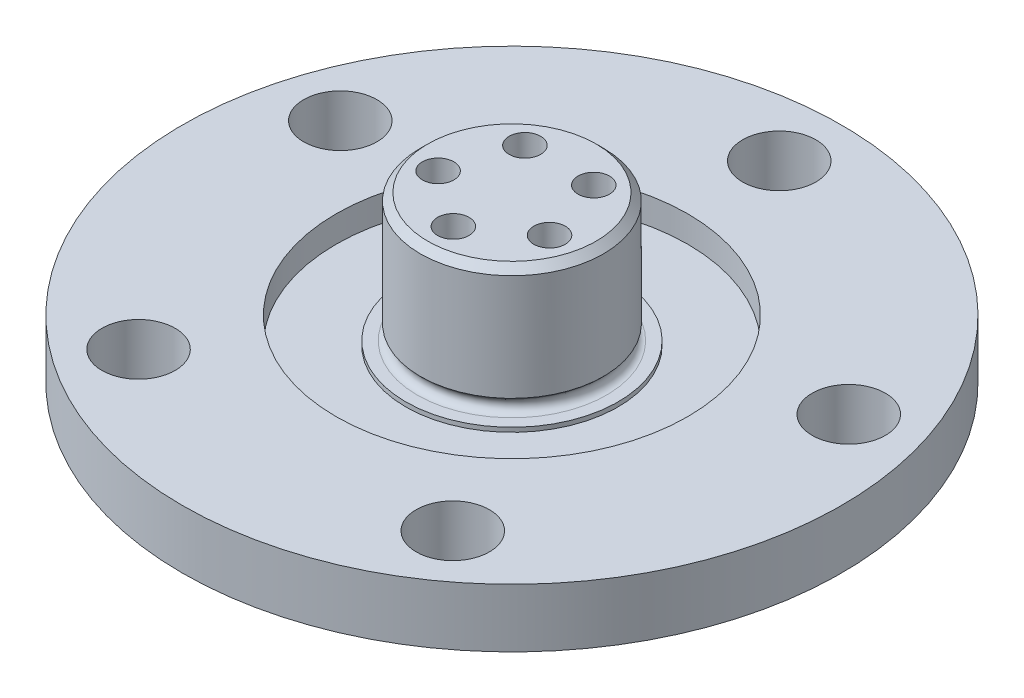
ISO-10303-21;
HEADER;
FILE_DESCRIPTION(('STEP AP214'),'2;1');
FILE_NAME('part.step','',(''),(''),'','','');
FILE_SCHEMA(('AUTOMOTIVE_DESIGN { 1 0 10303 214 1 1 1 1 }'));
ENDSEC;
DATA;
#1=APPLICATION_CONTEXT('core data for automotive mechanical design processes');
#2=APPLICATION_PROTOCOL_DEFINITION('international standard','automotive_design',2000,#1);
#3=PRODUCT_CONTEXT('',#1,'mechanical');
#4=PRODUCT('Part','Part','',(#3));
#5=PRODUCT_RELATED_PRODUCT_CATEGORY('part','',(#4));
#6=PRODUCT_DEFINITION_FORMATION('','',#4);
#7=PRODUCT_DEFINITION_CONTEXT('part definition',#1,'design');
#8=PRODUCT_DEFINITION('design','',#6,#7);
#9=PRODUCT_DEFINITION_SHAPE('','',#8);
#10=(LENGTH_UNIT() NAMED_UNIT(*) SI_UNIT(.MILLI.,.METRE.));
#11=(NAMED_UNIT(*) PLANE_ANGLE_UNIT() SI_UNIT($,.RADIAN.));
#12=(NAMED_UNIT(*) SI_UNIT($,.STERADIAN.) SOLID_ANGLE_UNIT());
#13=UNCERTAINTY_MEASURE_WITH_UNIT(LENGTH_MEASURE(1.E-05),#10,'distance_accuracy_value','');
#14=(GEOMETRIC_REPRESENTATION_CONTEXT(3) GLOBAL_UNCERTAINTY_ASSIGNED_CONTEXT((#13)) GLOBAL_UNIT_ASSIGNED_CONTEXT((#10,
#11,#12)) REPRESENTATION_CONTEXT('',''));
#15=CARTESIAN_POINT('',(0.,0.,0.));
#16=DIRECTION('',(0.,0.,1.));
#17=DIRECTION('',(1.,0.,0.));
#18=AXIS2_PLACEMENT_3D('',#15,#16,#17);
#19=CARTESIAN_POINT('',(0.,5.,0.));
#20=DIRECTION('',(0.,1.,0.));
#21=DIRECTION('',(0.,0.,1.));
#22=AXIS2_PLACEMENT_3D('',#19,#20,#21);
#23=CYLINDRICAL_SURFACE('',#22,12.5);
#24=CARTESIAN_POINT('',(0.,21.5,0.));
#25=DIRECTION('',(0.,-1.,0.));
#26=DIRECTION('',(0.,0.,-1.));
#27=AXIS2_PLACEMENT_3D('',#24,#25,#26);
#28=CIRCLE('',#27,12.5);
#29=CARTESIAN_POINT('',(0.,21.5,-12.5));
#30=VERTEX_POINT('',#29);
#31=EDGE_CURVE('E48',#30,#30,#28,.T.);
#32=ORIENTED_EDGE('',*,*,#31,.T.);
#33=EDGE_LOOP('',(#32));
#34=FACE_BOUND('',#33,.T.);
#35=CARTESIAN_POINT('',(0.,7.,0.));
#36=DIRECTION('',(0.,1.,0.));
#37=DIRECTION('',(0.,0.,1.));
#38=AXIS2_PLACEMENT_3D('',#35,#36,#37);
#39=CIRCLE('',#38,12.5);
#40=CARTESIAN_POINT('',(0.,7.,12.5));
#41=VERTEX_POINT('',#40);
#42=EDGE_CURVE('E143',#41,#41,#39,.T.);
#43=ORIENTED_EDGE('',*,*,#42,.T.);
#44=EDGE_LOOP('',(#43));
#45=FACE_BOUND('',#44,.T.);
#46=ADVANCED_FACE('F33',(#34,#45),#23,.T.);
#47=CARTESIAN_POINT('',(0.,5.,0.));
#48=DIRECTION('',(0.,1.,0.));
#49=DIRECTION('',(0.,0.,1.));
#50=AXIS2_PLACEMENT_3D('',#47,#48,#49);
#51=PLANE('',#50);
#52=CARTESIAN_POINT('',(0.,5.,0.));
#53=DIRECTION('',(0.,1.,0.));
#54=DIRECTION('',(0.,0.,1.));
#55=AXIS2_PLACEMENT_3D('',#52,#53,#54);
#56=CIRCLE('',#55,12.9142135623731);
#57=CARTESIAN_POINT('',(0.,5.,12.9142135623731));
#58=VERTEX_POINT('',#57);
#59=EDGE_CURVE('E10',#58,#58,#56,.F.);
#60=ORIENTED_EDGE('',*,*,#59,.T.);
#61=EDGE_LOOP('',(#60));
#62=FACE_BOUND('',#61,.T.);
#63=CARTESIAN_POINT('',(0.,5.,0.));
#64=DIRECTION('',(0.,1.,0.));
#65=DIRECTION('',(0.,0.,1.));
#66=AXIS2_PLACEMENT_3D('',#63,#64,#65);
#67=CIRCLE('',#66,14.5);
#68=CARTESIAN_POINT('',(0.,5.,14.5));
#69=VERTEX_POINT('',#68);
#70=EDGE_CURVE('E123',#69,#69,#67,.T.);
#71=ORIENTED_EDGE('',*,*,#70,.T.);
#72=EDGE_LOOP('',(#71));
#73=FACE_BOUND('',#72,.T.);
#74=ADVANCED_FACE('F161',(#62,#73),#51,.T.);
#75=CARTESIAN_POINT('',(0.,0.,0.));
#76=DIRECTION('',(0.,1.,0.));
#77=DIRECTION('',(0.,0.,1.));
#78=AXIS2_PLACEMENT_3D('',#75,#76,#77);
#79=PLANE('',#78);
#80=CARTESIAN_POINT('',(-7.60845213036006,0.,2.47213595500001));
#81=DIRECTION('',(0.,1.,0.));
#82=DIRECTION('',(0.,0.,1.));
#83=AXIS2_PLACEMENT_3D('',#80,#81,#82);
#84=CIRCLE('',#83,2.15);
#85=CARTESIAN_POINT('',(-7.60845213036006,0.,4.62213595500001));
#86=VERTEX_POINT('',#85);
#87=EDGE_CURVE('E87',#86,#86,#84,.T.);
#88=ORIENTED_EDGE('',*,*,#87,.T.);
#89=EDGE_LOOP('',(#88));
#90=FACE_BOUND('',#89,.T.);
#91=CARTESIAN_POINT('',(1.92137482375957E-12,0.,7.9999999999994));
#92=DIRECTION('',(0.,1.,0.));
#93=DIRECTION('',(0.,0.,1.));
#94=AXIS2_PLACEMENT_3D('',#91,#92,#93);
#95=CIRCLE('',#94,2.15);
#96=CARTESIAN_POINT('',(1.92137482375957E-12,0.,10.1499999999994));
#97=VERTEX_POINT('',#96);
#98=EDGE_CURVE('E92',#97,#97,#95,.T.);
#99=ORIENTED_EDGE('',*,*,#98,.T.);
#100=EDGE_LOOP('',(#99));
#101=FACE_BOUND('',#100,.T.);
#102=CARTESIAN_POINT('',(7.60845213036239,0.,2.47213595499794));
#103=DIRECTION('',(0.,1.,0.));
#104=DIRECTION('',(0.,0.,1.));
#105=AXIS2_PLACEMENT_3D('',#102,#103,#104);
#106=CIRCLE('',#105,2.15);
#107=CARTESIAN_POINT('',(7.60845213036239,0.,4.62213595499793));
#108=VERTEX_POINT('',#107);
#109=EDGE_CURVE('E95',#108,#108,#106,.T.);
#110=ORIENTED_EDGE('',*,*,#109,.T.);
#111=EDGE_LOOP('',(#110));
#112=FACE_BOUND('',#111,.T.);
#113=CARTESIAN_POINT('',(4.70228201833973,0.,-6.47213595500082));
#114=DIRECTION('',(0.,1.,0.));
#115=DIRECTION('',(0.,0.,1.));
#116=AXIS2_PLACEMENT_3D('',#113,#114,#115);
#117=CIRCLE('',#116,2.15);
#118=CARTESIAN_POINT('',(4.70228201833973,0.,-4.32213595500083));
#119=VERTEX_POINT('',#118);
#120=EDGE_CURVE('E98',#119,#119,#117,.T.);
#121=ORIENTED_EDGE('',*,*,#120,.T.);
#122=EDGE_LOOP('',(#121));
#123=FACE_BOUND('',#122,.T.);
#124=CARTESIAN_POINT('',(-4.70228201833984,0.,-6.47213595499954));
#125=DIRECTION('',(0.,1.,0.));
#126=DIRECTION('',(0.,0.,1.));
#127=AXIS2_PLACEMENT_3D('',#124,#125,#126);
#128=CIRCLE('',#127,2.15);
#129=CARTESIAN_POINT('',(-4.70228201833984,0.,-4.32213595499954));
#130=VERTEX_POINT('',#129);
#131=EDGE_CURVE('E101',#130,#130,#128,.T.);
#132=ORIENTED_EDGE('',*,*,#131,.T.);
#133=EDGE_LOOP('',(#132));
#134=FACE_BOUND('',#133,.T.);
#135=CARTESIAN_POINT('',(0.,0.,0.));
#136=DIRECTION('',(0.,-1.,0.));
#137=DIRECTION('',(0.,0.,-1.));
#138=AXIS2_PLACEMENT_3D('',#135,#136,#137);
#139=CIRCLE('',#138,19.9);
#140=CARTESIAN_POINT('',(0.,0.,-19.9));
#141=VERTEX_POINT('',#140);
#142=EDGE_CURVE('E111',#141,#141,#139,.T.);
#143=ORIENTED_EDGE('',*,*,#142,.T.);
#144=EDGE_LOOP('',(#143));
#145=FACE_BOUND('',#144,.T.);
#146=ADVANCED_FACE('F167',(#90,#101,#112,#123,#134,#145),#79,.F.);
#147=CARTESIAN_POINT('',(0.,8.,0.));
#148=DIRECTION('',(0.,1.,0.));
#149=DIRECTION('',(0.,0.,1.));
#150=AXIS2_PLACEMENT_3D('',#147,#148,#149);
#151=PLANE('',#150);
#152=CARTESIAN_POINT('',(0.,8.,0.));
#153=DIRECTION('',(0.,1.,0.));
#154=DIRECTION('',(0.,0.,1.));
#155=AXIS2_PLACEMENT_3D('',#152,#153,#154);
#156=CIRCLE('',#155,24.);
#157=CARTESIAN_POINT('',(0.,8.,24.));
#158=VERTEX_POINT('',#157);
#159=EDGE_CURVE('E114',#158,#158,#156,.T.);
#160=ORIENTED_EDGE('',*,*,#159,.F.);
#161=EDGE_LOOP('',(#160));
#162=FACE_BOUND('',#161,.T.);
#163=CARTESIAN_POINT('',(-21.4541617086725,8.,29.5291202946865));
#164=DIRECTION('',(0.,1.,0.));
#165=DIRECTION('',(0.,0.,1.));
#166=AXIS2_PLACEMENT_3D('',#163,#164,#165);
#167=CIRCLE('',#166,5.);
#168=CARTESIAN_POINT('',(-21.4541617086725,8.,34.5291202946865));
#169=VERTEX_POINT('',#168);
#170=EDGE_CURVE('E75',#169,#169,#167,.T.);
#171=ORIENTED_EDGE('',*,*,#170,.F.);
#172=EDGE_LOOP('',(#171));
#173=FACE_BOUND('',#172,.T.);
#174=CARTESIAN_POINT('',(34.7135628447742,8.,-11.2791202946871));
#175=DIRECTION('',(0.,1.,0.));
#176=DIRECTION('',(0.,0.,1.));
#177=AXIS2_PLACEMENT_3D('',#174,#175,#176);
#178=CIRCLE('',#177,5.);
#179=CARTESIAN_POINT('',(34.7135628447742,8.,-6.27912029468706));
#180=VERTEX_POINT('',#179);
#181=EDGE_CURVE('E63',#180,#180,#178,.T.);
#182=ORIENTED_EDGE('',*,*,#181,.F.);
#183=EDGE_LOOP('',(#182));
#184=FACE_BOUND('',#183,.T.);
#185=CARTESIAN_POINT('',(0.,8.,0.));
#186=DIRECTION('',(0.,1.,0.));
#187=DIRECTION('',(0.,0.,1.));
#188=AXIS2_PLACEMENT_3D('',#185,#186,#187);
#189=CIRCLE('',#188,45.);
#190=CARTESIAN_POINT('',(0.,8.,45.));
#191=VERTEX_POINT('',#190);
#192=EDGE_CURVE('E53',#191,#191,#189,.T.);
#193=ORIENTED_EDGE('',*,*,#192,.T.);
#194=EDGE_LOOP('',(#193));
#195=FACE_BOUND('',#194,.T.);
#196=CARTESIAN_POINT('',(0.,8.,-36.5));
#197=DIRECTION('',(0.,1.,0.));
#198=DIRECTION('',(0.,0.,1.));
#199=AXIS2_PLACEMENT_3D('',#196,#197,#198);
#200=CIRCLE('',#199,5.);
#201=CARTESIAN_POINT('',(0.,8.,-31.5));
#202=VERTEX_POINT('',#201);
#203=EDGE_CURVE('E57',#202,#202,#200,.T.);
#204=ORIENTED_EDGE('',*,*,#203,.F.);
#205=EDGE_LOOP('',(#204));
#206=FACE_BOUND('',#205,.T.);
#207=CARTESIAN_POINT('',(21.4541617086781,8.,29.5291202946847));
#208=DIRECTION('',(0.,1.,0.));
#209=DIRECTION('',(0.,0.,1.));
#210=AXIS2_PLACEMENT_3D('',#207,#208,#209);
#211=CIRCLE('',#210,5.);
#212=CARTESIAN_POINT('',(21.4541617086781,8.,34.5291202946847));
#213=VERTEX_POINT('',#212);
#214=EDGE_CURVE('E69',#213,#213,#211,.T.);
#215=ORIENTED_EDGE('',*,*,#214,.F.);
#216=EDGE_LOOP('',(#215));
#217=FACE_BOUND('',#216,.T.);
#218=CARTESIAN_POINT('',(-34.713562844772,8.,-11.2791202946841));
#219=DIRECTION('',(0.,1.,0.));
#220=DIRECTION('',(0.,0.,1.));
#221=AXIS2_PLACEMENT_3D('',#218,#219,#220);
#222=CIRCLE('',#221,5.);
#223=CARTESIAN_POINT('',(-34.713562844772,8.,-6.2791202946841));
#224=VERTEX_POINT('',#223);
#225=EDGE_CURVE('E81',#224,#224,#222,.T.);
#226=ORIENTED_EDGE('',*,*,#225,.F.);
#227=EDGE_LOOP('',(#226));
#228=FACE_BOUND('',#227,.T.);
#229=ADVANCED_FACE('F230',(#162,#173,#184,#195,#206,#217,#228),#151,.T.);
#230=CARTESIAN_POINT('',(0.,0.,0.));
#231=DIRECTION('',(0.,-1.,0.));
#232=DIRECTION('',(0.,0.,-1.));
#233=AXIS2_PLACEMENT_3D('',#230,#231,#232);
#234=CIRCLE('',#233,30.1);
#235=CARTESIAN_POINT('',(0.,0.,-30.1));
#236=VERTEX_POINT('',#235);
#237=EDGE_CURVE('E105',#236,#236,#234,.T.);
#238=ORIENTED_EDGE('',*,*,#237,.F.);
#239=EDGE_LOOP('',(#238));
#240=FACE_BOUND('',#239,.T.);
#241=CARTESIAN_POINT('',(0.,0.,0.));
#242=DIRECTION('',(0.,1.,0.));
#243=DIRECTION('',(0.,0.,1.));
#244=AXIS2_PLACEMENT_3D('',#241,#242,#243);
#245=CIRCLE('',#244,45.);
#246=CARTESIAN_POINT('',(0.,0.,45.));
#247=VERTEX_POINT('',#246);
#248=EDGE_CURVE('E54',#247,#247,#245,.T.);
#249=ORIENTED_EDGE('',*,*,#248,.F.);
#250=EDGE_LOOP('',(#249));
#251=FACE_BOUND('',#250,.T.);
#252=CARTESIAN_POINT('',(0.,0.,-36.5));
#253=DIRECTION('',(0.,1.,0.));
#254=DIRECTION('',(0.,0.,1.));
#255=AXIS2_PLACEMENT_3D('',#252,#253,#254);
#256=CIRCLE('',#255,5.);
#257=CARTESIAN_POINT('',(0.,0.,-31.5));
#258=VERTEX_POINT('',#257);
#259=EDGE_CURVE('E60',#258,#258,#256,.T.);
#260=ORIENTED_EDGE('',*,*,#259,.T.);
#261=EDGE_LOOP('',(#260));
#262=FACE_BOUND('',#261,.T.);
#263=CARTESIAN_POINT('',(34.7135628447742,0.,-11.2791202946871));
#264=DIRECTION('',(0.,1.,0.));
#265=DIRECTION('',(0.,0.,1.));
#266=AXIS2_PLACEMENT_3D('',#263,#264,#265);
#267=CIRCLE('',#266,5.);
#268=CARTESIAN_POINT('',(34.7135628447742,0.,-6.27912029468706));
#269=VERTEX_POINT('',#268);
#270=EDGE_CURVE('E66',#269,#269,#267,.T.);
#271=ORIENTED_EDGE('',*,*,#270,.T.);
#272=EDGE_LOOP('',(#271));
#273=FACE_BOUND('',#272,.T.);
#274=CARTESIAN_POINT('',(21.4541617086781,0.,29.5291202946847));
#275=DIRECTION('',(0.,1.,0.));
#276=DIRECTION('',(0.,0.,1.));
#277=AXIS2_PLACEMENT_3D('',#274,#275,#276);
#278=CIRCLE('',#277,5.);
#279=CARTESIAN_POINT('',(21.4541617086781,0.,34.5291202946847));
#280=VERTEX_POINT('',#279);
#281=EDGE_CURVE('E72',#280,#280,#278,.T.);
#282=ORIENTED_EDGE('',*,*,#281,.T.);
#283=EDGE_LOOP('',(#282));
#284=FACE_BOUND('',#283,.T.);
#285=CARTESIAN_POINT('',(-21.4541617086725,0.,29.5291202946865));
#286=DIRECTION('',(0.,1.,0.));
#287=DIRECTION('',(0.,0.,1.));
#288=AXIS2_PLACEMENT_3D('',#285,#286,#287);
#289=CIRCLE('',#288,5.);
#290=CARTESIAN_POINT('',(-21.4541617086725,0.,34.5291202946865));
#291=VERTEX_POINT('',#290);
#292=EDGE_CURVE('E78',#291,#291,#289,.T.);
#293=ORIENTED_EDGE('',*,*,#292,.T.);
#294=EDGE_LOOP('',(#293));
#295=FACE_BOUND('',#294,.T.);
#296=CARTESIAN_POINT('',(-34.713562844772,0.,-11.2791202946841));
#297=DIRECTION('',(0.,1.,0.));
#298=DIRECTION('',(0.,0.,1.));
#299=AXIS2_PLACEMENT_3D('',#296,#297,#298);
#300=CIRCLE('',#299,5.);
#301=CARTESIAN_POINT('',(-34.713562844772,0.,-6.2791202946841));
#302=VERTEX_POINT('',#301);
#303=EDGE_CURVE('E84',#302,#302,#300,.T.);
#304=ORIENTED_EDGE('',*,*,#303,.T.);
#305=EDGE_LOOP('',(#304));
#306=FACE_BOUND('',#305,.T.);
#307=ADVANCED_FACE('F233',(#240,#251,#262,#273,#284,#295,#306),#79,.F.);
#308=CARTESIAN_POINT('',(0.,8.,0.));
#309=DIRECTION('',(0.,-1.,0.));
#310=DIRECTION('',(0.,0.,-1.));
#311=AXIS2_PLACEMENT_3D('',#308,#309,#310);
#312=CYLINDRICAL_SURFACE('',#311,45.);
#313=ORIENTED_EDGE('',*,*,#192,.F.);
#314=EDGE_LOOP('',(#313));
#315=FACE_BOUND('',#314,.T.);
#316=ORIENTED_EDGE('',*,*,#248,.T.);
#317=EDGE_LOOP('',(#316));
#318=FACE_BOUND('',#317,.T.);
#319=ADVANCED_FACE('F228',(#315,#318),#312,.T.);
#320=CARTESIAN_POINT('',(0.,8.,-36.5));
#321=DIRECTION('',(0.,-1.,0.));
#322=DIRECTION('',(0.,0.,-1.));
#323=AXIS2_PLACEMENT_3D('',#320,#321,#322);
#324=CYLINDRICAL_SURFACE('',#323,5.);
#325=ORIENTED_EDGE('',*,*,#203,.T.);
#326=EDGE_LOOP('',(#325));
#327=FACE_BOUND('',#326,.T.);
#328=ORIENTED_EDGE('',*,*,#259,.F.);
#329=EDGE_LOOP('',(#328));
#330=FACE_BOUND('',#329,.T.);
#331=ADVANCED_FACE('F224',(#327,#330),#324,.F.);
#332=CARTESIAN_POINT('',(34.7135628447742,8.,-11.2791202946871));
#333=DIRECTION('',(0.,-1.,0.));
#334=DIRECTION('',(0.,0.,-1.));
#335=AXIS2_PLACEMENT_3D('',#332,#333,#334);
#336=CYLINDRICAL_SURFACE('',#335,5.);
#337=ORIENTED_EDGE('',*,*,#181,.T.);
#338=EDGE_LOOP('',(#337));
#339=FACE_BOUND('',#338,.T.);
#340=ORIENTED_EDGE('',*,*,#270,.F.);
#341=EDGE_LOOP('',(#340));
#342=FACE_BOUND('',#341,.T.);
#343=ADVANCED_FACE('F220',(#339,#342),#336,.F.);
#344=CARTESIAN_POINT('',(21.4541617086781,8.,29.5291202946847));
#345=DIRECTION('',(0.,-1.,0.));
#346=DIRECTION('',(0.,0.,-1.));
#347=AXIS2_PLACEMENT_3D('',#344,#345,#346);
#348=CYLINDRICAL_SURFACE('',#347,5.);
#349=ORIENTED_EDGE('',*,*,#214,.T.);
#350=EDGE_LOOP('',(#349));
#351=FACE_BOUND('',#350,.T.);
#352=ORIENTED_EDGE('',*,*,#281,.F.);
#353=EDGE_LOOP('',(#352));
#354=FACE_BOUND('',#353,.T.);
#355=ADVANCED_FACE('F216',(#351,#354),#348,.F.);
#356=CARTESIAN_POINT('',(-21.4541617086725,8.,29.5291202946865));
#357=DIRECTION('',(0.,-1.,0.));
#358=DIRECTION('',(0.,0.,-1.));
#359=AXIS2_PLACEMENT_3D('',#356,#357,#358);
#360=CYLINDRICAL_SURFACE('',#359,5.);
#361=ORIENTED_EDGE('',*,*,#170,.T.);
#362=EDGE_LOOP('',(#361));
#363=FACE_BOUND('',#362,.T.);
#364=ORIENTED_EDGE('',*,*,#292,.F.);
#365=EDGE_LOOP('',(#364));
#366=FACE_BOUND('',#365,.T.);
#367=ADVANCED_FACE('F212',(#363,#366),#360,.F.);
#368=CARTESIAN_POINT('',(-34.713562844772,8.,-11.2791202946841));
#369=DIRECTION('',(0.,-1.,0.));
#370=DIRECTION('',(0.,0.,-1.));
#371=AXIS2_PLACEMENT_3D('',#368,#369,#370);
#372=CYLINDRICAL_SURFACE('',#371,5.);
#373=ORIENTED_EDGE('',*,*,#225,.T.);
#374=EDGE_LOOP('',(#373));
#375=FACE_BOUND('',#374,.T.);
#376=ORIENTED_EDGE('',*,*,#303,.F.);
#377=EDGE_LOOP('',(#376));
#378=FACE_BOUND('',#377,.T.);
#379=ADVANCED_FACE('F208',(#375,#378),#372,.F.);
#380=CARTESIAN_POINT('',(-7.60845213036006,8.,2.47213595500001));
#381=DIRECTION('',(0.,1.,0.));
#382=DIRECTION('',(0.,0.,1.));
#383=AXIS2_PLACEMENT_3D('',#380,#381,#382);
#384=CYLINDRICAL_SURFACE('',#383,2.15);
#385=ORIENTED_EDGE('',*,*,#87,.F.);
#386=EDGE_LOOP('',(#385));
#387=FACE_BOUND('',#386,.T.);
#388=CARTESIAN_POINT('',(-7.60845213036006,22.5,2.47213595500001));
#389=DIRECTION('',(0.,-1.,0.));
#390=DIRECTION('',(0.,0.,-1.));
#391=AXIS2_PLACEMENT_3D('',#388,#389,#390);
#392=CIRCLE('',#391,2.15);
#393=CARTESIAN_POINT('',(-7.60845213036006,22.5,0.322135955000015));
#394=VERTEX_POINT('',#393);
#395=EDGE_CURVE('E137',#394,#394,#392,.T.);
#396=ORIENTED_EDGE('',*,*,#395,.F.);
#397=EDGE_LOOP('',(#396));
#398=FACE_BOUND('',#397,.T.);
#399=ADVANCED_FACE('F204',(#387,#398),#384,.F.);
#400=CARTESIAN_POINT('',(1.92137482375957E-12,8.,7.9999999999994));
#401=DIRECTION('',(0.,1.,0.));
#402=DIRECTION('',(0.,0.,1.));
#403=AXIS2_PLACEMENT_3D('',#400,#401,#402);
#404=CYLINDRICAL_SURFACE('',#403,2.15);
#405=ORIENTED_EDGE('',*,*,#98,.F.);
#406=EDGE_LOOP('',(#405));
#407=FACE_BOUND('',#406,.T.);
#408=CARTESIAN_POINT('',(1.92137482375957E-12,22.5,7.9999999999994));
#409=DIRECTION('',(0.,-1.,0.));
#410=DIRECTION('',(0.,0.,-1.));
#411=AXIS2_PLACEMENT_3D('',#408,#409,#410);
#412=CIRCLE('',#411,2.15);
#413=CARTESIAN_POINT('',(1.92137482375957E-12,22.5,5.8499999999994));
#414=VERTEX_POINT('',#413);
#415=EDGE_CURVE('E140',#414,#414,#412,.T.);
#416=ORIENTED_EDGE('',*,*,#415,.F.);
#417=EDGE_LOOP('',(#416));
#418=FACE_BOUND('',#417,.T.);
#419=ADVANCED_FACE('F200',(#407,#418),#404,.F.);
#420=CARTESIAN_POINT('',(7.60845213036239,8.,2.47213595499794));
#421=DIRECTION('',(0.,1.,0.));
#422=DIRECTION('',(0.,0.,1.));
#423=AXIS2_PLACEMENT_3D('',#420,#421,#422);
#424=CYLINDRICAL_SURFACE('',#423,2.15);
#425=ORIENTED_EDGE('',*,*,#109,.F.);
#426=EDGE_LOOP('',(#425));
#427=FACE_BOUND('',#426,.T.);
#428=CARTESIAN_POINT('',(7.60845213036239,22.5,2.47213595499794));
#429=DIRECTION('',(0.,-1.,0.));
#430=DIRECTION('',(0.,0.,-1.));
#431=AXIS2_PLACEMENT_3D('',#428,#429,#430);
#432=CIRCLE('',#431,2.15);
#433=CARTESIAN_POINT('',(7.60845213036239,22.5,0.322135954997937));
#434=VERTEX_POINT('',#433);
#435=EDGE_CURVE('E126',#434,#434,#432,.T.);
#436=ORIENTED_EDGE('',*,*,#435,.F.);
#437=EDGE_LOOP('',(#436));
#438=FACE_BOUND('',#437,.T.);
#439=ADVANCED_FACE('F196',(#427,#438),#424,.F.);
#440=CARTESIAN_POINT('',(4.70228201833973,8.,-6.47213595500082));
#441=DIRECTION('',(0.,1.,0.));
#442=DIRECTION('',(0.,0.,1.));
#443=AXIS2_PLACEMENT_3D('',#440,#441,#442);
#444=CYLINDRICAL_SURFACE('',#443,2.15);
#445=ORIENTED_EDGE('',*,*,#120,.F.);
#446=EDGE_LOOP('',(#445));
#447=FACE_BOUND('',#446,.T.);
#448=CARTESIAN_POINT('',(4.70228201833973,22.5,-6.47213595500082));
#449=DIRECTION('',(0.,-1.,0.));
#450=DIRECTION('',(0.,0.,-1.));
#451=AXIS2_PLACEMENT_3D('',#448,#449,#450);
#452=CIRCLE('',#451,2.15);
#453=CARTESIAN_POINT('',(4.70228201833973,22.5,-8.62213595500082));
#454=VERTEX_POINT('',#453);
#455=EDGE_CURVE('E131',#454,#454,#452,.T.);
#456=ORIENTED_EDGE('',*,*,#455,.F.);
#457=EDGE_LOOP('',(#456));
#458=FACE_BOUND('',#457,.T.);
#459=ADVANCED_FACE('F192',(#447,#458),#444,.F.);
#460=CARTESIAN_POINT('',(-4.70228201833984,8.,-6.47213595499954));
#461=DIRECTION('',(0.,1.,0.));
#462=DIRECTION('',(0.,0.,1.));
#463=AXIS2_PLACEMENT_3D('',#460,#461,#462);
#464=CYLINDRICAL_SURFACE('',#463,2.15);
#465=ORIENTED_EDGE('',*,*,#131,.F.);
#466=EDGE_LOOP('',(#465));
#467=FACE_BOUND('',#466,.T.);
#468=CARTESIAN_POINT('',(-4.70228201833984,22.5,-6.47213595499954));
#469=DIRECTION('',(0.,-1.,0.));
#470=DIRECTION('',(0.,0.,-1.));
#471=AXIS2_PLACEMENT_3D('',#468,#469,#470);
#472=CIRCLE('',#471,2.15);
#473=CARTESIAN_POINT('',(-4.70228201833984,22.5,-8.62213595499954));
#474=VERTEX_POINT('',#473);
#475=EDGE_CURVE('E134',#474,#474,#472,.T.);
#476=ORIENTED_EDGE('',*,*,#475,.F.);
#477=EDGE_LOOP('',(#476));
#478=FACE_BOUND('',#477,.T.);
#479=ADVANCED_FACE('F188',(#467,#478),#464,.F.);
#480=CARTESIAN_POINT('',(0.,1.5,0.));
#481=DIRECTION('',(0.,-1.,0.));
#482=DIRECTION('',(0.,0.,-1.));
#483=AXIS2_PLACEMENT_3D('',#480,#481,#482);
#484=CYLINDRICAL_SURFACE('',#483,30.1);
#485=CARTESIAN_POINT('',(0.,1.5,0.));
#486=DIRECTION('',(0.,-1.,0.));
#487=DIRECTION('',(0.,0.,-1.));
#488=AXIS2_PLACEMENT_3D('',#485,#486,#487);
#489=CIRCLE('',#488,30.1);
#490=CARTESIAN_POINT('',(0.,1.5,-30.1));
#491=VERTEX_POINT('',#490);
#492=EDGE_CURVE('E104',#491,#491,#489,.T.);
#493=ORIENTED_EDGE('',*,*,#492,.F.);
#494=EDGE_LOOP('',(#493));
#495=FACE_BOUND('',#494,.T.);
#496=ORIENTED_EDGE('',*,*,#237,.T.);
#497=EDGE_LOOP('',(#496));
#498=FACE_BOUND('',#497,.T.);
#499=ADVANCED_FACE('F184',(#495,#498),#484,.F.);
#500=CARTESIAN_POINT('',(0.,1.5,0.));
#501=DIRECTION('',(0.,-1.,0.));
#502=DIRECTION('',(0.,0.,-1.));
#503=AXIS2_PLACEMENT_3D('',#500,#501,#502);
#504=PLANE('',#503);
#505=CARTESIAN_POINT('',(0.,1.5,0.));
#506=DIRECTION('',(0.,-1.,0.));
#507=DIRECTION('',(0.,0.,-1.));
#508=AXIS2_PLACEMENT_3D('',#505,#506,#507);
#509=CIRCLE('',#508,19.9);
#510=CARTESIAN_POINT('',(0.,1.5,-19.9));
#511=VERTEX_POINT('',#510);
#512=EDGE_CURVE('E108',#511,#511,#509,.T.);
#513=ORIENTED_EDGE('',*,*,#512,.F.);
#514=EDGE_LOOP('',(#513));
#515=FACE_BOUND('',#514,.T.);
#516=ORIENTED_EDGE('',*,*,#492,.T.);
#517=EDGE_LOOP('',(#516));
#518=FACE_BOUND('',#517,.T.);
#519=ADVANCED_FACE('F180',(#515,#518),#504,.T.);
#520=CARTESIAN_POINT('',(0.,1.5,0.));
#521=DIRECTION('',(0.,-1.,0.));
#522=DIRECTION('',(0.,0.,-1.));
#523=AXIS2_PLACEMENT_3D('',#520,#521,#522);
#524=CYLINDRICAL_SURFACE('',#523,19.9);
#525=ORIENTED_EDGE('',*,*,#512,.T.);
#526=EDGE_LOOP('',(#525));
#527=FACE_BOUND('',#526,.T.);
#528=ORIENTED_EDGE('',*,*,#142,.F.);
#529=EDGE_LOOP('',(#528));
#530=FACE_BOUND('',#529,.T.);
#531=ADVANCED_FACE('F176',(#527,#530),#524,.T.);
#532=CARTESIAN_POINT('',(0.,5.,0.));
#533=DIRECTION('',(0.,1.,0.));
#534=DIRECTION('',(0.,0.,1.));
#535=AXIS2_PLACEMENT_3D('',#532,#533,#534);
#536=CYLINDRICAL_SURFACE('',#535,24.);
#537=ORIENTED_EDGE('',*,*,#159,.T.);
#538=EDGE_LOOP('',(#537));
#539=FACE_BOUND('',#538,.T.);
#540=CARTESIAN_POINT('',(0.,4.4,0.));
#541=DIRECTION('',(0.,1.,0.));
#542=DIRECTION('',(0.,0.,1.));
#543=AXIS2_PLACEMENT_3D('',#540,#541,#542);
#544=CIRCLE('',#543,24.);
#545=CARTESIAN_POINT('',(0.,4.4,24.));
#546=VERTEX_POINT('',#545);
#547=EDGE_CURVE('E119',#546,#546,#544,.T.);
#548=ORIENTED_EDGE('',*,*,#547,.F.);
#549=EDGE_LOOP('',(#548));
#550=FACE_BOUND('',#549,.T.);
#551=ADVANCED_FACE('F173',(#539,#550),#536,.F.);
#552=CARTESIAN_POINT('',(0.,4.4,0.));
#553=DIRECTION('',(0.,1.,0.));
#554=DIRECTION('',(0.,0.,1.));
#555=AXIS2_PLACEMENT_3D('',#552,#553,#554);
#556=PLANE('',#555);
#557=CARTESIAN_POINT('',(0.,4.4,0.));
#558=DIRECTION('',(0.,1.,0.));
#559=DIRECTION('',(0.,0.,1.));
#560=AXIS2_PLACEMENT_3D('',#557,#558,#559);
#561=CIRCLE('',#560,14.5);
#562=CARTESIAN_POINT('',(0.,4.4,14.5));
#563=VERTEX_POINT('',#562);
#564=EDGE_CURVE('E122',#563,#563,#561,.T.);
#565=ORIENTED_EDGE('',*,*,#564,.F.);
#566=EDGE_LOOP('',(#565));
#567=FACE_BOUND('',#566,.T.);
#568=ORIENTED_EDGE('',*,*,#547,.T.);
#569=EDGE_LOOP('',(#568));
#570=FACE_BOUND('',#569,.T.);
#571=ADVANCED_FACE('F170',(#567,#570),#556,.T.);
#572=CARTESIAN_POINT('',(0.,4.4,0.));
#573=DIRECTION('',(0.,1.,0.));
#574=DIRECTION('',(0.,0.,1.));
#575=AXIS2_PLACEMENT_3D('',#572,#573,#574);
#576=CYLINDRICAL_SURFACE('',#575,14.5);
#577=ORIENTED_EDGE('',*,*,#564,.T.);
#578=EDGE_LOOP('',(#577));
#579=FACE_BOUND('',#578,.T.);
#580=ORIENTED_EDGE('',*,*,#70,.F.);
#581=EDGE_LOOP('',(#580));
#582=FACE_BOUND('',#581,.T.);
#583=ADVANCED_FACE('F339',(#579,#582),#576,.T.);
#584=CARTESIAN_POINT('',(0.,22.5,0.));
#585=DIRECTION('',(0.,-1.,0.));
#586=DIRECTION('',(0.,0.,-1.));
#587=AXIS2_PLACEMENT_3D('',#584,#585,#586);
#588=PLANE('',#587);
#589=CARTESIAN_POINT('',(0.,22.5,0.));
#590=DIRECTION('',(0.,-1.,0.));
#591=DIRECTION('',(0.,0.,-1.));
#592=AXIS2_PLACEMENT_3D('',#589,#590,#591);
#593=CIRCLE('',#592,11.5);
#594=CARTESIAN_POINT('',(0.,22.5,-11.5));
#595=VERTEX_POINT('',#594);
#596=EDGE_CURVE('E44',#595,#595,#593,.F.);
#597=ORIENTED_EDGE('',*,*,#596,.T.);
#598=EDGE_LOOP('',(#597));
#599=FACE_BOUND('',#598,.T.);
#600=ORIENTED_EDGE('',*,*,#415,.T.);
#601=EDGE_LOOP('',(#600));
#602=FACE_BOUND('',#601,.T.);
#603=ORIENTED_EDGE('',*,*,#395,.T.);
#604=EDGE_LOOP('',(#603));
#605=FACE_BOUND('',#604,.T.);
#606=ORIENTED_EDGE('',*,*,#475,.T.);
#607=EDGE_LOOP('',(#606));
#608=FACE_BOUND('',#607,.T.);
#609=ORIENTED_EDGE('',*,*,#455,.T.);
#610=EDGE_LOOP('',(#609));
#611=FACE_BOUND('',#610,.T.);
#612=ORIENTED_EDGE('',*,*,#435,.T.);
#613=EDGE_LOOP('',(#612));
#614=FACE_BOUND('',#613,.T.);
#615=ADVANCED_FACE('F157',(#599,#602,#605,#608,#611,#614),#588,.F.);
#616=CARTESIAN_POINT('',(0.,21.5,0.));
#617=DIRECTION('',(0.,-1.,0.));
#618=DIRECTION('',(0.,0.,-1.));
#619=AXIS2_PLACEMENT_3D('',#616,#617,#618);
#620=CONICAL_SURFACE('',#619,12.5,0.785398163397456);
#621=ORIENTED_EDGE('',*,*,#596,.F.);
#622=EDGE_LOOP('',(#621));
#623=FACE_BOUND('',#622,.T.);
#624=ORIENTED_EDGE('',*,*,#31,.F.);
#625=EDGE_LOOP('',(#624));
#626=FACE_BOUND('',#625,.T.);
#627=ADVANCED_FACE('F150',(#623,#626),#620,.T.);
#628=CARTESIAN_POINT('',(0.,7.,0.));
#629=DIRECTION('',(0.,1.,0.));
#630=DIRECTION('',(0.,0.,1.));
#631=AXIS2_PLACEMENT_3D('',#628,#629,#630);
#632=CONICAL_SURFACE('',#631,12.5,0.785398163397448);
#633=CARTESIAN_POINT('',(0.,6.70710678118655,0.));
#634=DIRECTION('',(0.,1.,0.));
#635=DIRECTION('',(0.,0.,1.));
#636=AXIS2_PLACEMENT_3D('',#633,#634,#635);
#637=CIRCLE('',#636,12.2071067811865);
#638=CARTESIAN_POINT('',(0.,6.70710678118655,12.2071067811865));
#639=VERTEX_POINT('',#638);
#640=EDGE_CURVE('E40',#639,#639,#637,.T.);
#641=ORIENTED_EDGE('',*,*,#640,.T.);
#642=EDGE_LOOP('',(#641));
#643=FACE_BOUND('',#642,.T.);
#644=ORIENTED_EDGE('',*,*,#42,.F.);
#645=EDGE_LOOP('',(#644));
#646=FACE_BOUND('',#645,.T.);
#647=ADVANCED_FACE('F148',(#643,#646),#632,.T.);
#648=CARTESIAN_POINT('',(0.,6.,0.));
#649=DIRECTION('',(0.,1.,0.));
#650=DIRECTION('',(0.,0.,1.));
#651=AXIS2_PLACEMENT_3D('',#648,#649,#650);
#652=TOROIDAL_SURFACE('',#651,12.9142135623731,1.);
#653=ORIENTED_EDGE('',*,*,#59,.F.);
#654=EDGE_LOOP('',(#653));
#655=FACE_BOUND('',#654,.T.);
#656=ORIENTED_EDGE('',*,*,#640,.F.);
#657=EDGE_LOOP('',(#656));
#658=FACE_BOUND('',#657,.T.);
#659=ADVANCED_FACE('F35',(#655,#658),#652,.F.);
#660=CLOSED_SHELL('',(#46,#74,#146,#229,#307,#319,#331,#343,#355,#367,#379,#399,#419,#439,#459,
#479,#499,#519,#531,#551,#571,#583,#615,#627,#647,#659));
#661=MANIFOLD_SOLID_BREP('B2',#660);
#662=ADVANCED_BREP_SHAPE_REPRESENTATION('',(#18,#661),#14);
#663=SHAPE_DEFINITION_REPRESENTATION(#9,#662);
ENDSEC;
END-ISO-10303-21;
